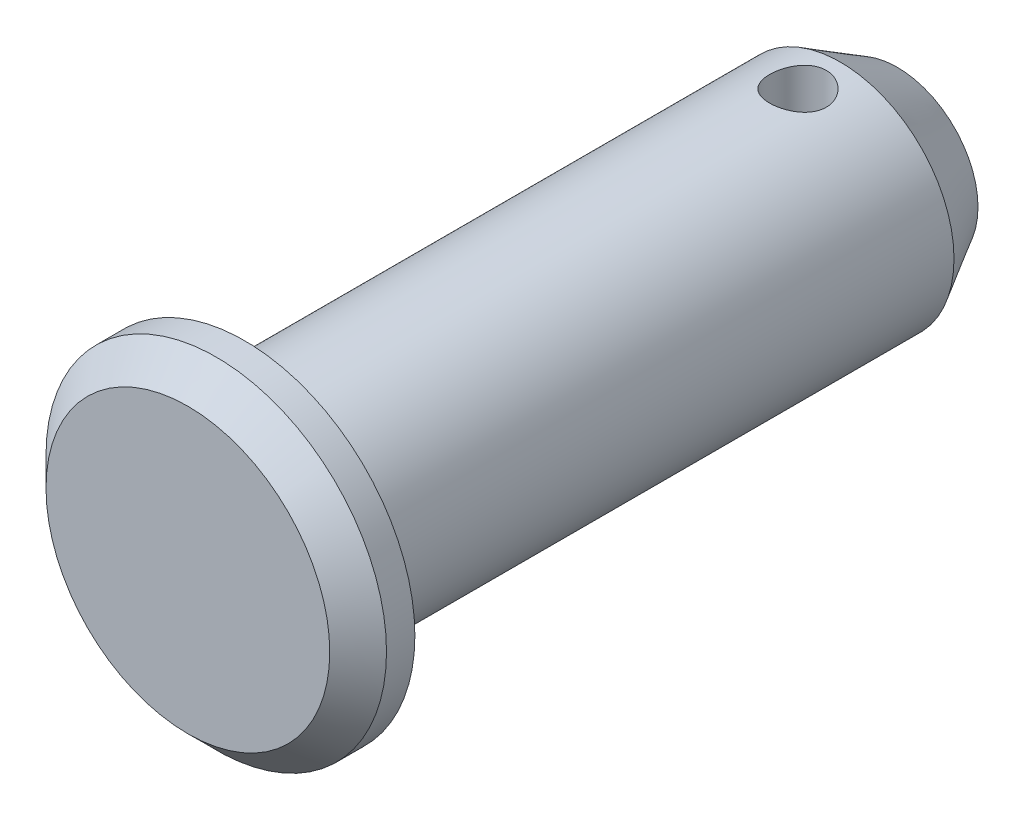
ISO-10303-21;
HEADER;
FILE_DESCRIPTION(('STEP AP214'),'2;1');
FILE_NAME('part.step','',(''),(''),'','','');
FILE_SCHEMA(('AUTOMOTIVE_DESIGN { 1 0 10303 214 1 1 1 1 }'));
ENDSEC;
DATA;
#1=APPLICATION_CONTEXT('core data for automotive mechanical design processes');
#2=APPLICATION_PROTOCOL_DEFINITION('international standard','automotive_design',2000,#1);
#3=PRODUCT_CONTEXT('',#1,'mechanical');
#4=PRODUCT('Part','Part','',(#3));
#5=PRODUCT_RELATED_PRODUCT_CATEGORY('part','',(#4));
#6=PRODUCT_DEFINITION_FORMATION('','',#4);
#7=PRODUCT_DEFINITION_CONTEXT('part definition',#1,'design');
#8=PRODUCT_DEFINITION('design','',#6,#7);
#9=PRODUCT_DEFINITION_SHAPE('','',#8);
#10=(LENGTH_UNIT() NAMED_UNIT(*) SI_UNIT(.MILLI.,.METRE.));
#11=(NAMED_UNIT(*) PLANE_ANGLE_UNIT() SI_UNIT($,.RADIAN.));
#12=(NAMED_UNIT(*) SI_UNIT($,.STERADIAN.) SOLID_ANGLE_UNIT());
#13=UNCERTAINTY_MEASURE_WITH_UNIT(LENGTH_MEASURE(1.E-05),#10,'distance_accuracy_value','');
#14=(GEOMETRIC_REPRESENTATION_CONTEXT(3) GLOBAL_UNCERTAINTY_ASSIGNED_CONTEXT((#13)) GLOBAL_UNIT_ASSIGNED_CONTEXT((#10,
#11,#12)) REPRESENTATION_CONTEXT('',''));
#15=CARTESIAN_POINT('',(0.,0.,0.));
#16=DIRECTION('',(0.,0.,1.));
#17=DIRECTION('',(1.,0.,0.));
#18=AXIS2_PLACEMENT_3D('',#15,#16,#17);
#19=CARTESIAN_POINT('',(0.,0.,12.5));
#20=DIRECTION('',(0.,0.,-1.));
#21=DIRECTION('',(-1.,0.,0.));
#22=AXIS2_PLACEMENT_3D('',#19,#20,#21);
#23=PLANE('',#22);
#24=CARTESIAN_POINT('',(0.,0.,12.5));
#25=DIRECTION('',(0.,0.,1.));
#26=DIRECTION('',(1.,0.,0.));
#27=AXIS2_PLACEMENT_3D('',#24,#25,#26);
#28=CIRCLE('',#27,5.);
#29=CARTESIAN_POINT('',(5.,0.,12.5));
#30=VERTEX_POINT('',#29);
#31=EDGE_CURVE('E10',#30,#30,#28,.T.);
#32=ORIENTED_EDGE('',*,*,#31,.T.);
#33=EDGE_LOOP('',(#32));
#34=FACE_BOUND('',#33,.T.);
#35=ADVANCED_FACE('F33',(#34),#23,.F.);
#36=CARTESIAN_POINT('',(0.,0.,11.5));
#37=DIRECTION('',(0.,0.,-1.));
#38=DIRECTION('',(-1.,0.,0.));
#39=AXIS2_PLACEMENT_3D('',#36,#37,#38);
#40=CONICAL_SURFACE('',#39,6.,0.785398163397447);
#41=ORIENTED_EDGE('',*,*,#31,.F.);
#42=EDGE_LOOP('',(#41));
#43=FACE_BOUND('',#42,.T.);
#44=CARTESIAN_POINT('',(0.,0.,11.5));
#45=DIRECTION('',(0.,0.,1.));
#46=DIRECTION('',(1.,0.,0.));
#47=AXIS2_PLACEMENT_3D('',#44,#45,#46);
#48=CIRCLE('',#47,6.);
#49=CARTESIAN_POINT('',(6.,0.,11.5));
#50=VERTEX_POINT('',#49);
#51=EDGE_CURVE('E45',#50,#50,#48,.T.);
#52=ORIENTED_EDGE('',*,*,#51,.T.);
#53=EDGE_LOOP('',(#52));
#54=FACE_BOUND('',#53,.T.);
#55=ADVANCED_FACE('F82',(#43,#54),#40,.T.);
#56=CARTESIAN_POINT('',(0.,0.,12.5));
#57=DIRECTION('',(0.,0.,1.));
#58=DIRECTION('',(1.,0.,0.));
#59=AXIS2_PLACEMENT_3D('',#56,#57,#58);
#60=CYLINDRICAL_SURFACE('',#59,6.);
#61=ORIENTED_EDGE('',*,*,#51,.F.);
#62=EDGE_LOOP('',(#61));
#63=FACE_BOUND('',#62,.T.);
#64=CARTESIAN_POINT('',(0.,0.,10.5));
#65=DIRECTION('',(0.,0.,1.));
#66=DIRECTION('',(1.,0.,0.));
#67=AXIS2_PLACEMENT_3D('',#64,#65,#66);
#68=CIRCLE('',#67,6.);
#69=CARTESIAN_POINT('',(6.,0.,10.5));
#70=VERTEX_POINT('',#69);
#71=EDGE_CURVE('E50',#70,#70,#68,.T.);
#72=ORIENTED_EDGE('',*,*,#71,.T.);
#73=EDGE_LOOP('',(#72));
#74=FACE_BOUND('',#73,.T.);
#75=ADVANCED_FACE('F86',(#63,#74),#60,.T.);
#76=CARTESIAN_POINT('',(0.,0.,10.5));
#77=DIRECTION('',(0.,0.,1.));
#78=DIRECTION('',(1.,0.,0.));
#79=AXIS2_PLACEMENT_3D('',#76,#77,#78);
#80=PLANE('',#79);
#81=ORIENTED_EDGE('',*,*,#71,.F.);
#82=EDGE_LOOP('',(#81));
#83=FACE_BOUND('',#82,.T.);
#84=CARTESIAN_POINT('',(0.,0.,10.5));
#85=DIRECTION('',(0.,0.,1.));
#86=DIRECTION('',(1.,0.,0.));
#87=AXIS2_PLACEMENT_3D('',#84,#85,#86);
#88=CIRCLE('',#87,4.);
#89=CARTESIAN_POINT('',(4.,0.,10.5));
#90=VERTEX_POINT('',#89);
#91=EDGE_CURVE('E103',#90,#90,#88,.T.);
#92=ORIENTED_EDGE('',*,*,#91,.T.);
#93=EDGE_LOOP('',(#92));
#94=FACE_BOUND('',#93,.T.);
#95=ADVANCED_FACE('F77',(#83,#94),#80,.F.);
#96=CARTESIAN_POINT('',(0.,0.,12.5));
#97=DIRECTION('',(0.,0.,1.));
#98=DIRECTION('',(1.,0.,0.));
#99=AXIS2_PLACEMENT_3D('',#96,#97,#98);
#100=CYLINDRICAL_SURFACE('',#99,4.);
#101=CARTESIAN_POINT('',(0.,-4.,-8.));
#102=CARTESIAN_POINT('',(0.0552507257798206,-3.99999906578675,-8.00000155049211));
#103=CARTESIAN_POINT('',(0.110518771887175,-3.99884385421219,-8.00459436718253));
#104=CARTESIAN_POINT('',(0.219470882513688,-3.99434742553262,-8.022816767538));
#105=CARTESIAN_POINT('',(0.27315403124716,-3.99100496946646,-8.03645147302523));
#106=CARTESIAN_POINT('',(0.377347248121718,-3.98250417554693,-8.07229283564139));
#107=CARTESIAN_POINT('',(0.427861042286669,-3.97734801894725,-8.09448919914352));
#108=CARTESIAN_POINT('',(0.524448087936284,-3.96576895871729,-8.14678759336322));
#109=CARTESIAN_POINT('',(0.57052118956584,-3.95934601236034,-8.17688989074596));
#110=CARTESIAN_POINT('',(0.657867951533947,-3.94578275727868,-8.24480052643614));
#111=CARTESIAN_POINT('',(0.699037126707381,-3.93863138099022,-8.28274104997279));
#112=CARTESIAN_POINT('',(0.774499284802203,-3.92449080078353,-8.36496813660594));
#113=CARTESIAN_POINT('',(0.808791491299423,-3.91750161525566,-8.40925541529766));
#114=CARTESIAN_POINT('',(0.870017695199355,-3.9043651713314,-8.50373015115829));
#115=CARTESIAN_POINT('',(0.896834810616905,-3.89823196313737,-8.55399548720694));
#116=CARTESIAN_POINT('',(0.941597939033685,-3.88766329874815,-8.65849894110558));
#117=CARTESIAN_POINT('',(0.959545370292889,-3.88322757115193,-8.71273642221718));
#118=CARTESIAN_POINT('',(0.985703224536194,-3.87666984478367,-8.82249566546832));
#119=CARTESIAN_POINT('',(0.994101512222226,-3.87450327383617,-8.87796993069987));
#120=CARTESIAN_POINT('',(1.00150785004524,-3.87259575025161,-8.98957904600932));
#121=CARTESIAN_POINT('',(1.00051742787865,-3.87285440299096,-9.04571378713241));
#122=CARTESIAN_POINT('',(0.989324349759521,-3.87572803664412,-9.15561053849632));
#123=CARTESIAN_POINT('',(0.979345560127014,-3.87828575334586,-9.20939708097673));
#124=CARTESIAN_POINT('',(0.950816124602071,-3.88537806450989,-9.3145073672742));
#125=CARTESIAN_POINT('',(0.932264868046282,-3.88991279980464,-9.36583093535266));
#126=CARTESIAN_POINT('',(0.886926318624769,-3.90050075936125,-9.46515867750138));
#127=CARTESIAN_POINT('',(0.860057778155273,-3.90656884979614,-9.51312411452637));
#128=CARTESIAN_POINT('',(0.798904184009969,-3.91953140564257,-9.60394580650456));
#129=CARTESIAN_POINT('',(0.764617832539225,-3.9264260155649,-9.64680116537817));
#130=CARTESIAN_POINT('',(0.688442283120811,-3.94050587026521,-9.7274690771296));
#131=CARTESIAN_POINT('',(0.646364172110573,-3.94769379651981,-9.76510299337424));
#132=CARTESIAN_POINT('',(0.556407945002466,-3.96137310385857,-9.8328141616426));
#133=CARTESIAN_POINT('',(0.508529651805295,-3.96786446366277,-9.86289118284238));
#134=CARTESIAN_POINT('',(0.408077259120927,-3.97945154729455,-9.91470039081626));
#135=CARTESIAN_POINT('',(0.355487595472415,-3.9845424008515,-9.93640356016962));
#136=CARTESIAN_POINT('',(0.247250672095254,-3.99271944660946,-9.97061153713972));
#137=CARTESIAN_POINT('',(0.191603999433656,-3.99580602226187,-9.98311810427876));
#138=CARTESIAN_POINT('',(0.0803599802600172,-3.9995699951425,-9.99830504370589));
#139=CARTESIAN_POINT('',(0.0247978133254726,-4.00030702338853,-10.0012286840502));
#140=CARTESIAN_POINT('',(-0.0860219165343393,-3.99945869876301,-9.99783399862967));
#141=CARTESIAN_POINT('',(-0.141279506429731,-3.99787355494564,-9.99151650480058));
#142=CARTESIAN_POINT('',(-0.249076179184328,-3.99259720751571,-9.97001939440575));
#143=CARTESIAN_POINT('',(-0.301643412645837,-3.98893756123874,-9.95497249101534));
#144=CARTESIAN_POINT('',(-0.403504861635008,-3.97992471089423,-9.91659527731437));
#145=CARTESIAN_POINT('',(-0.452798746021757,-3.97457133579928,-9.89326413045789));
#146=CARTESIAN_POINT('',(-0.547682089619898,-3.96262205284207,-9.83850924741685));
#147=CARTESIAN_POINT('',(-0.59319029455722,-3.95600578244622,-9.80694925840216));
#148=CARTESIAN_POINT('',(-0.678351075762164,-3.94229672791613,-9.73680672746869));
#149=CARTESIAN_POINT('',(-0.718002639315339,-3.93520386167803,-9.69822297358873));
#150=CARTESIAN_POINT('',(-0.791327045381821,-3.92112637973848,-9.61399869277036));
#151=CARTESIAN_POINT('',(-0.824829245081355,-3.91414869458187,-9.56820819799839));
#152=CARTESIAN_POINT('',(-0.883673839341799,-3.90128585584826,-9.47151157702286));
#153=CARTESIAN_POINT('',(-0.909016596105292,-3.89540065378018,-9.42060567802683));
#154=CARTESIAN_POINT('',(-0.950634280406195,-3.88545396489777,-9.31539618505795));
#155=CARTESIAN_POINT('',(-0.96696293110271,-3.88138170194604,-9.26111491443733));
#156=CARTESIAN_POINT('',(-0.990230439969186,-3.87551162726789,-9.15046024140726));
#157=CARTESIAN_POINT('',(-0.997171351652439,-3.87371331813291,-9.09408729931167));
#158=CARTESIAN_POINT('',(-1.00135906022266,-3.87263267469305,-8.98258598409653));
#159=CARTESIAN_POINT('',(-0.998878598520079,-3.87327955152176,-8.92746837658351));
#160=CARTESIAN_POINT('',(-0.984918185541911,-3.87685272671895,-8.81846407422135));
#161=CARTESIAN_POINT('',(-0.973438415124512,-3.87977897927905,-8.76457735465757));
#162=CARTESIAN_POINT('',(-0.941954212961862,-3.88754173788482,-8.65986102728973));
#163=CARTESIAN_POINT('',(-0.922000936453583,-3.89236676824207,-8.60901512983986));
#164=CARTESIAN_POINT('',(-0.874176609070047,-3.90338503816553,-8.51135641152421));
#165=CARTESIAN_POINT('',(-0.846304460022792,-3.90957846747182,-8.46454415120872));
#166=CARTESIAN_POINT('',(-0.782578499091424,-3.92283756175675,-8.37496358066532));
#167=CARTESIAN_POINT('',(-0.746535441941502,-3.92992176554505,-8.33233261771736));
#168=CARTESIAN_POINT('',(-0.667859580793156,-3.94405351497524,-8.25363530346973));
#169=CARTESIAN_POINT('',(-0.625225214174096,-3.95110105151373,-8.21757051325802));
#170=CARTESIAN_POINT('',(-0.533645057801726,-3.96451770431776,-8.15239246095693));
#171=CARTESIAN_POINT('',(-0.484598948210923,-3.97087222243912,-8.12341692421895));
#172=CARTESIAN_POINT('',(-0.382177373006983,-3.98203283316746,-8.07416835803965));
#173=CARTESIAN_POINT('',(-0.328805042291158,-3.98684003466521,-8.05388909290098));
#174=CARTESIAN_POINT('',(-0.229606835495646,-3.99365373043694,-8.02561877978023));
#175=CARTESIAN_POINT('',(-0.184253447272044,-3.99601723368461,-8.01603250463105));
#176=CARTESIAN_POINT('',(-0.0926040476908546,-3.99919070154632,-8.00322270425204));
#177=CARTESIAN_POINT('',(-0.0463081074950771,-4.00000078300596,-7.99999870046313));
#178=CARTESIAN_POINT('',(0.,-4.,-8.));
#179=B_SPLINE_CURVE_WITH_KNOTS('',3,(#101,#102,#103,#104,#105,#106,#107,#108,#109,#110,#111,
#112,#113,#114,#115,#116,#117,#118,#119,#120,#121,#122,#123,#124,#125,#126,#127,#128,#129,#130,
#131,#132,#133,#134,#135,#136,#137,#138,#139,#140,#141,#142,#143,#144,#145,#146,#147,#148,#149,
#150,#151,#152,#153,#154,#155,#156,#157,#158,#159,#160,#161,#162,#163,#164,#165,#166,#167,#168,
#169,#170,#171,#172,#173,#174,#175,#176,#177,#178),.UNSPECIFIED.,.T.,.F.,(4,2,2,2,2,2,2,2,2,2,2,
2,2,2,2,2,2,2,2,2,2,2,2,2,2,2,2,2,2,2,2,2,2,2,2,2,2,2,4),(0.,0.16558247498126,0.331258825175933,
0.496736601524071,0.662219960112886,0.83076290291426,0.999324863867079,1.17039098363871,
1.34142974112912,1.50904196732954,1.67662692075131,1.84014998004679,2.00368468977359,
2.16887018582586,2.33408460557442,2.50401000646013,2.67394059705498,2.84445486006076,
3.01493649125762,3.18105539299517,3.34715934075162,3.51080183009358,3.67446084881527,
3.84102391710235,4.00761575338679,4.17829672802984,4.34897012499672,4.51861503076024,
4.68822282168272,4.85295853599075,5.0176909397069,5.18144267039632,5.34521712091268,
5.51326384273274,5.68135046513612,5.85248123666392,6.02348909214234,6.16228161961433,
6.3010637069536),.UNSPECIFIED.);
#180=CARTESIAN_POINT('',(0.,-4.,-8.));
#181=VERTEX_POINT('',#180);
#182=EDGE_CURVE('E36',#181,#181,#179,.T.);
#183=ORIENTED_EDGE('',*,*,#182,.T.);
#184=EDGE_LOOP('',(#183));
#185=FACE_BOUND('',#184,.T.);
#186=CARTESIAN_POINT('',(0.,4.,-8.));
#187=CARTESIAN_POINT('',(-0.0552507257798206,3.99999906578675,-8.00000155049211));
#188=CARTESIAN_POINT('',(-0.110518771887175,3.99884385421219,-8.00459436718253));
#189=CARTESIAN_POINT('',(-0.219470882513688,3.99434742553262,-8.022816767538));
#190=CARTESIAN_POINT('',(-0.27315403124716,3.99100496946646,-8.03645147302523));
#191=CARTESIAN_POINT('',(-0.377347248121718,3.98250417554693,-8.07229283564139));
#192=CARTESIAN_POINT('',(-0.427861042286669,3.97734801894725,-8.09448919914352));
#193=CARTESIAN_POINT('',(-0.524448087936284,3.96576895871729,-8.14678759336322));
#194=CARTESIAN_POINT('',(-0.57052118956584,3.95934601236034,-8.17688989074596));
#195=CARTESIAN_POINT('',(-0.657867951533947,3.94578275727868,-8.24480052643614));
#196=CARTESIAN_POINT('',(-0.699037126707381,3.93863138099022,-8.28274104997279));
#197=CARTESIAN_POINT('',(-0.774499284802203,3.92449080078353,-8.36496813660595));
#198=CARTESIAN_POINT('',(-0.808791491299423,3.91750161525566,-8.40925541529766));
#199=CARTESIAN_POINT('',(-0.870017695199355,3.9043651713314,-8.50373015115829));
#200=CARTESIAN_POINT('',(-0.896834810616905,3.89823196313737,-8.55399548720694));
#201=CARTESIAN_POINT('',(-0.941597939033685,3.88766329874816,-8.65849894110558));
#202=CARTESIAN_POINT('',(-0.959545370292889,3.88322757115193,-8.71273642221718));
#203=CARTESIAN_POINT('',(-0.985703224536194,3.87666984478367,-8.82249566546832));
#204=CARTESIAN_POINT('',(-0.994101512222226,3.87450327383617,-8.87796993069987));
#205=CARTESIAN_POINT('',(-1.00150785004524,3.87259575025161,-8.98957904600932));
#206=CARTESIAN_POINT('',(-1.00051742787865,3.87285440299096,-9.04571378713241));
#207=CARTESIAN_POINT('',(-0.989324349759521,3.87572803664412,-9.15561053849632));
#208=CARTESIAN_POINT('',(-0.979345560127014,3.87828575334586,-9.20939708097673));
#209=CARTESIAN_POINT('',(-0.950816124602071,3.88537806450989,-9.3145073672742));
#210=CARTESIAN_POINT('',(-0.932264868046282,3.88991279980464,-9.36583093535266));
#211=CARTESIAN_POINT('',(-0.886926318624769,3.90050075936125,-9.46515867750138));
#212=CARTESIAN_POINT('',(-0.860057778155273,3.90656884979614,-9.51312411452637));
#213=CARTESIAN_POINT('',(-0.798904184009969,3.91953140564258,-9.60394580650456));
#214=CARTESIAN_POINT('',(-0.764617832539225,3.9264260155649,-9.64680116537817));
#215=CARTESIAN_POINT('',(-0.688442283120811,3.94050587026521,-9.7274690771296));
#216=CARTESIAN_POINT('',(-0.646364172110573,3.94769379651981,-9.76510299337424));
#217=CARTESIAN_POINT('',(-0.556407945002466,3.96137310385857,-9.8328141616426));
#218=CARTESIAN_POINT('',(-0.508529651805295,3.96786446366277,-9.86289118284238));
#219=CARTESIAN_POINT('',(-0.408077259120927,3.97945154729455,-9.91470039081626));
#220=CARTESIAN_POINT('',(-0.355487595472415,3.9845424008515,-9.93640356016962));
#221=CARTESIAN_POINT('',(-0.247250672095254,3.99271944660946,-9.97061153713972));
#222=CARTESIAN_POINT('',(-0.191603999433656,3.99580602226187,-9.98311810427876));
#223=CARTESIAN_POINT('',(-0.0803599802600174,3.9995699951425,-9.99830504370589));
#224=CARTESIAN_POINT('',(-0.0247978133254728,4.00030702338853,-10.0012286840502));
#225=CARTESIAN_POINT('',(0.0860219165343391,3.99945869876301,-9.99783399862967));
#226=CARTESIAN_POINT('',(0.14127950642973,3.99787355494564,-9.99151650480058));
#227=CARTESIAN_POINT('',(0.249076179184328,3.99259720751571,-9.97001939440575));
#228=CARTESIAN_POINT('',(0.301643412645837,3.98893756123874,-9.95497249101534));
#229=CARTESIAN_POINT('',(0.403504861635008,3.97992471089423,-9.91659527731437));
#230=CARTESIAN_POINT('',(0.452798746021757,3.97457133579928,-9.89326413045789));
#231=CARTESIAN_POINT('',(0.547682089619898,3.96262205284207,-9.83850924741685));
#232=CARTESIAN_POINT('',(0.593190294557219,3.95600578244622,-9.80694925840216));
#233=CARTESIAN_POINT('',(0.678351075762163,3.94229672791613,-9.73680672746869));
#234=CARTESIAN_POINT('',(0.718002639315339,3.93520386167803,-9.69822297358873));
#235=CARTESIAN_POINT('',(0.791327045381821,3.92112637973848,-9.61399869277036));
#236=CARTESIAN_POINT('',(0.824829245081355,3.91414869458187,-9.56820819799839));
#237=CARTESIAN_POINT('',(0.883673839341799,3.90128585584826,-9.47151157702286));
#238=CARTESIAN_POINT('',(0.909016596105292,3.89540065378017,-9.42060567802683));
#239=CARTESIAN_POINT('',(0.950634280406195,3.88545396489777,-9.31539618505795));
#240=CARTESIAN_POINT('',(0.96696293110271,3.88138170194604,-9.26111491443733));
#241=CARTESIAN_POINT('',(0.990230439969186,3.87551162726789,-9.15046024140726));
#242=CARTESIAN_POINT('',(0.997171351652439,3.87371331813291,-9.09408729931167));
#243=CARTESIAN_POINT('',(1.00135906022266,3.87263267469305,-8.98258598409653));
#244=CARTESIAN_POINT('',(0.998878598520079,3.87327955152176,-8.92746837658351));
#245=CARTESIAN_POINT('',(0.984918185541911,3.87685272671895,-8.81846407422135));
#246=CARTESIAN_POINT('',(0.973438415124512,3.87977897927905,-8.76457735465757));
#247=CARTESIAN_POINT('',(0.941954212961862,3.88754173788482,-8.65986102728973));
#248=CARTESIAN_POINT('',(0.922000936453583,3.89236676824206,-8.60901512983986));
#249=CARTESIAN_POINT('',(0.874176609070047,3.90338503816552,-8.51135641152421));
#250=CARTESIAN_POINT('',(0.846304460022792,3.90957846747182,-8.46454415120872));
#251=CARTESIAN_POINT('',(0.782578499091424,3.92283756175675,-8.37496358066532));
#252=CARTESIAN_POINT('',(0.746535441941502,3.92992176554505,-8.33233261771736));
#253=CARTESIAN_POINT('',(0.667859580793156,3.94405351497524,-8.25363530346973));
#254=CARTESIAN_POINT('',(0.625225214174097,3.95110105151373,-8.21757051325802));
#255=CARTESIAN_POINT('',(0.533645057801727,3.96451770431776,-8.15239246095693));
#256=CARTESIAN_POINT('',(0.484598948210924,3.97087222243912,-8.12341692421895));
#257=CARTESIAN_POINT('',(0.382177373006983,3.98203283316746,-8.07416835803965));
#258=CARTESIAN_POINT('',(0.328805042291159,3.98684003466521,-8.05388909290098));
#259=CARTESIAN_POINT('',(0.229606835495646,3.99365373043694,-8.02561877978023));
#260=CARTESIAN_POINT('',(0.184253447272044,3.9960172336846,-8.01603250463105));
#261=CARTESIAN_POINT('',(0.0926040476908546,3.99919070154632,-8.00322270425204));
#262=CARTESIAN_POINT('',(0.0463081074950771,4.00000078300596,-7.99999870046313));
#263=CARTESIAN_POINT('',(0.,4.,-8.));
#264=B_SPLINE_CURVE_WITH_KNOTS('',3,(#186,#187,#188,#189,#190,#191,#192,#193,#194,#195,#196,
#197,#198,#199,#200,#201,#202,#203,#204,#205,#206,#207,#208,#209,#210,#211,#212,#213,#214,#215,
#216,#217,#218,#219,#220,#221,#222,#223,#224,#225,#226,#227,#228,#229,#230,#231,#232,#233,#234,
#235,#236,#237,#238,#239,#240,#241,#242,#243,#244,#245,#246,#247,#248,#249,#250,#251,#252,#253,
#254,#255,#256,#257,#258,#259,#260,#261,#262,#263),.UNSPECIFIED.,.T.,.F.,(4,2,2,2,2,2,2,2,2,2,2,
2,2,2,2,2,2,2,2,2,2,2,2,2,2,2,2,2,2,2,2,2,2,2,2,2,2,2,4),(0.,0.16558247498126,0.331258825175933,
0.49673660152407,0.662219960112886,0.830762902914261,0.999324863867079,1.17039098363871,
1.34142974112912,1.50904196732954,1.67662692075131,1.84014998004679,2.00368468977359,
2.16887018582586,2.33408460557442,2.50401000646013,2.67394059705498,2.84445486006076,
3.01493649125762,3.18105539299518,3.34715934075162,3.51080183009358,3.67446084881527,
3.84102391710235,4.0076157533868,4.17829672802984,4.34897012499672,4.51861503076025,
4.68822282168272,4.85295853599075,5.0176909397069,5.18144267039632,5.34521712091268,
5.51326384273274,5.68135046513612,5.85248123666392,6.02348909214234,6.16228161961433,
6.3010637069536),.UNSPECIFIED.);
#265=CARTESIAN_POINT('',(0.,4.,-8.));
#266=VERTEX_POINT('',#265);
#267=EDGE_CURVE('E53',#266,#266,#264,.T.);
#268=ORIENTED_EDGE('',*,*,#267,.T.);
#269=EDGE_LOOP('',(#268));
#270=FACE_BOUND('',#269,.T.);
#271=ORIENTED_EDGE('',*,*,#91,.F.);
#272=EDGE_LOOP('',(#271));
#273=FACE_BOUND('',#272,.T.);
#274=CARTESIAN_POINT('',(0.,0.,-10.5));
#275=DIRECTION('',(0.,0.,1.));
#276=DIRECTION('',(1.,0.,0.));
#277=AXIS2_PLACEMENT_3D('',#274,#275,#276);
#278=CIRCLE('',#277,4.);
#279=CARTESIAN_POINT('',(4.,0.,-10.5));
#280=VERTEX_POINT('',#279);
#281=EDGE_CURVE('E105',#280,#280,#278,.T.);
#282=ORIENTED_EDGE('',*,*,#281,.T.);
#283=EDGE_LOOP('',(#282));
#284=FACE_BOUND('',#283,.T.);
#285=ADVANCED_FACE('F58',(#185,#270,#273,#284),#100,.T.);
#286=CARTESIAN_POINT('',(0.,0.,-12.5));
#287=DIRECTION('',(0.,0.,1.));
#288=DIRECTION('',(1.,0.,0.));
#289=AXIS2_PLACEMENT_3D('',#286,#287,#288);
#290=CONICAL_SURFACE('',#289,2.84529946162075,0.523598775598298);
#291=ORIENTED_EDGE('',*,*,#281,.F.);
#292=EDGE_LOOP('',(#291));
#293=FACE_BOUND('',#292,.T.);
#294=CARTESIAN_POINT('',(0.,0.,-12.5));
#295=DIRECTION('',(0.,0.,1.));
#296=DIRECTION('',(1.,0.,0.));
#297=AXIS2_PLACEMENT_3D('',#294,#295,#296);
#298=CIRCLE('',#297,2.84529946162075);
#299=CARTESIAN_POINT('',(2.84529946162075,0.,-12.5));
#300=VERTEX_POINT('',#299);
#301=EDGE_CURVE('E108',#300,#300,#298,.T.);
#302=ORIENTED_EDGE('',*,*,#301,.T.);
#303=EDGE_LOOP('',(#302));
#304=FACE_BOUND('',#303,.T.);
#305=ADVANCED_FACE('F70',(#293,#304),#290,.T.);
#306=CARTESIAN_POINT('',(0.,0.,-12.5));
#307=DIRECTION('',(0.,0.,1.));
#308=DIRECTION('',(1.,0.,0.));
#309=AXIS2_PLACEMENT_3D('',#306,#307,#308);
#310=PLANE('',#309);
#311=ORIENTED_EDGE('',*,*,#301,.F.);
#312=EDGE_LOOP('',(#311));
#313=FACE_BOUND('',#312,.T.);
#314=ADVANCED_FACE('F66',(#313),#310,.F.);
#315=CARTESIAN_POINT('',(0.,-6.,-9.));
#316=DIRECTION('',(0.,1.,0.));
#317=DIRECTION('',(0.,0.,1.));
#318=AXIS2_PLACEMENT_3D('',#315,#316,#317);
#319=CYLINDRICAL_SURFACE('',#318,1.);
#320=ORIENTED_EDGE('',*,*,#267,.F.);
#321=EDGE_LOOP('',(#320));
#322=FACE_BOUND('',#321,.T.);
#323=ORIENTED_EDGE('',*,*,#182,.F.);
#324=EDGE_LOOP('',(#323));
#325=FACE_BOUND('',#324,.T.);
#326=ADVANCED_FACE('F62',(#322,#325),#319,.F.);
#327=CLOSED_SHELL('',(#35,#55,#75,#95,#285,#305,#314,#326));
#328=MANIFOLD_SOLID_BREP('B2',#327);
#329=ADVANCED_BREP_SHAPE_REPRESENTATION('',(#18,#328),#14);
#330=SHAPE_DEFINITION_REPRESENTATION(#9,#329);
ENDSEC;
END-ISO-10303-21;
